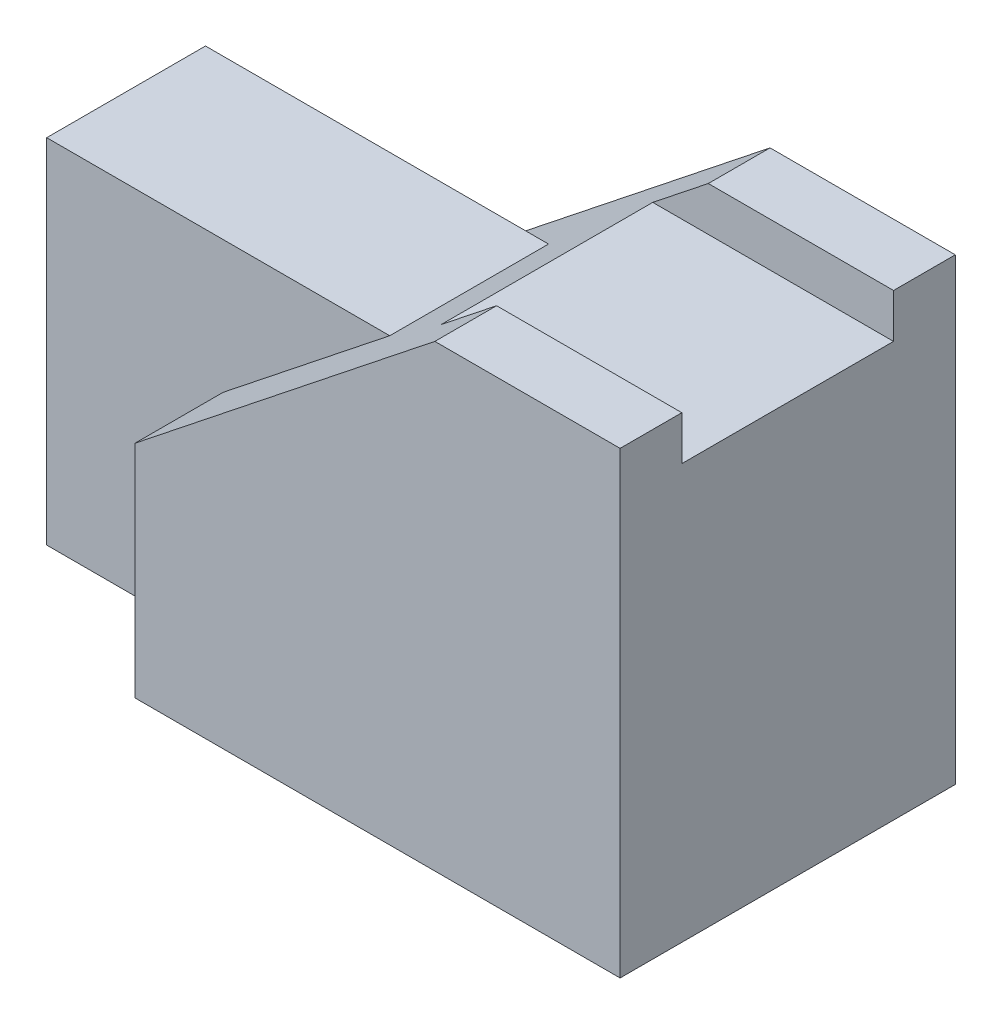
ISO-10303-21;
HEADER;
FILE_DESCRIPTION(('STEP AP214'),'2;1');
FILE_NAME('part.step','',(''),(''),'','','');
FILE_SCHEMA(('AUTOMOTIVE_DESIGN { 1 0 10303 214 1 1 1 1 }'));
ENDSEC;
DATA;
#1=APPLICATION_CONTEXT('core data for automotive mechanical design processes');
#2=APPLICATION_PROTOCOL_DEFINITION('international standard','automotive_design',2000,#1);
#3=PRODUCT_CONTEXT('',#1,'mechanical');
#4=PRODUCT('Part','Part','',(#3));
#5=PRODUCT_RELATED_PRODUCT_CATEGORY('part','',(#4));
#6=PRODUCT_DEFINITION_FORMATION('','',#4);
#7=PRODUCT_DEFINITION_CONTEXT('part definition',#1,'design');
#8=PRODUCT_DEFINITION('design','',#6,#7);
#9=PRODUCT_DEFINITION_SHAPE('','',#8);
#10=(LENGTH_UNIT() NAMED_UNIT(*) SI_UNIT(.MILLI.,.METRE.));
#11=(NAMED_UNIT(*) PLANE_ANGLE_UNIT() SI_UNIT($,.RADIAN.));
#12=(NAMED_UNIT(*) SI_UNIT($,.STERADIAN.) SOLID_ANGLE_UNIT());
#13=UNCERTAINTY_MEASURE_WITH_UNIT(LENGTH_MEASURE(1.E-05),#10,'distance_accuracy_value','');
#14=(GEOMETRIC_REPRESENTATION_CONTEXT(3) GLOBAL_UNCERTAINTY_ASSIGNED_CONTEXT((#13)) GLOBAL_UNIT_ASSIGNED_CONTEXT((#10,
#11,#12)) REPRESENTATION_CONTEXT('',''));
#15=CARTESIAN_POINT('',(0.,0.,0.));
#16=DIRECTION('',(0.,0.,1.));
#17=DIRECTION('',(1.,0.,0.));
#18=AXIS2_PLACEMENT_3D('',#15,#16,#17);
#19=CARTESIAN_POINT('',(0.,22.8737780043899,-19.));
#20=DIRECTION('',(0.,1.,0.));
#21=DIRECTION('',(0.,0.,1.));
#22=AXIS2_PLACEMENT_3D('',#19,#20,#21);
#23=PLANE('',#22);
#24=DIRECTION('',(1.,0.,0.));
#25=VECTOR('',#24,1.);
#26=CARTESIAN_POINT('',(-56.5700764194176,22.8737780043899,12.));
#27=LINE('',#26,#25);
#28=CARTESIAN_POINT('',(-1.57007641941765,22.8737780043899,12.));
#29=VERTEX_POINT('',#28);
#30=CARTESIAN_POINT('',(19.4299235805824,22.8737780043899,12.));
#31=VERTEX_POINT('',#30);
#32=EDGE_CURVE('E176',#29,#31,#27,.T.);
#33=ORIENTED_EDGE('',*,*,#32,.F.);
#34=DIRECTION('',(0.,0.,1.));
#35=VECTOR('',#34,1.);
#36=CARTESIAN_POINT('',(-1.57007641941765,22.8737780043899,-19.));
#37=LINE('',#36,#35);
#38=CARTESIAN_POINT('',(-1.57007641941765,22.8737780043899,19.));
#39=VERTEX_POINT('',#38);
#40=EDGE_CURVE('E51',#29,#39,#37,.T.);
#41=ORIENTED_EDGE('',*,*,#40,.T.);
#42=DIRECTION('',(-1.,0.,0.));
#43=VECTOR('',#42,1.);
#44=CARTESIAN_POINT('',(0.,22.8737780043899,19.));
#45=LINE('',#44,#43);
#46=CARTESIAN_POINT('',(19.4299235805824,22.8737780043899,19.));
#47=VERTEX_POINT('',#46);
#48=EDGE_CURVE('E249',#47,#39,#45,.T.);
#49=ORIENTED_EDGE('',*,*,#48,.F.);
#50=DIRECTION('',(0.,0.,1.));
#51=VECTOR('',#50,1.);
#52=CARTESIAN_POINT('',(19.4299235805824,22.8737780043899,-19.));
#53=LINE('',#52,#51);
#54=EDGE_CURVE('E273',#31,#47,#53,.T.);
#55=ORIENTED_EDGE('',*,*,#54,.F.);
#56=EDGE_LOOP('',(#33,#41,#49,#55));
#57=FACE_BOUND('',#56,.T.);
#58=ADVANCED_FACE('F41',(#57),#23,.T.);
#59=CARTESIAN_POINT('',(-11.7467978343689,14.7922639395757,-19.));
#60=DIRECTION('',(0.621882143601586,-0.783110847498294,0.));
#61=DIRECTION('',(0.783110847498294,0.621882143601586,0.));
#62=AXIS2_PLACEMENT_3D('',#59,#60,#61);
#63=PLANE('',#62);
#64=ORIENTED_EDGE('',*,*,#40,.F.);
#65=DIRECTION('',(-0.783110847498294,-0.621882143601586,0.));
#66=VECTOR('',#65,1.);
#67=CARTESIAN_POINT('',(-11.7467978343689,14.7922639395757,12.));
#68=LINE('',#67,#66);
#69=CARTESIAN_POINT('',(-7.86637271571394,17.8737780043899,12.));
#70=VERTEX_POINT('',#69);
#71=EDGE_CURVE('E186',#29,#70,#68,.T.);
#72=ORIENTED_EDGE('',*,*,#71,.T.);
#73=DIRECTION('',(0.,0.,-1.));
#74=VECTOR('',#73,1.);
#75=CARTESIAN_POINT('',(-7.86637271571394,17.8737780043899,-19.));
#76=LINE('',#75,#74);
#77=CARTESIAN_POINT('',(-7.86637271571394,17.8737780043899,-12.));
#78=VERTEX_POINT('',#77);
#79=EDGE_CURVE('E179',#70,#78,#76,.T.);
#80=ORIENTED_EDGE('',*,*,#79,.T.);
#81=DIRECTION('',(0.783110847498294,0.621882143601586,0.));
#82=VECTOR('',#81,1.);
#83=CARTESIAN_POINT('',(-11.7467978343689,14.7922639395757,-12.));
#84=LINE('',#83,#82);
#85=CARTESIAN_POINT('',(-1.57007641941765,22.8737780043899,-12.));
#86=VERTEX_POINT('',#85);
#87=EDGE_CURVE('E153',#78,#86,#84,.T.);
#88=ORIENTED_EDGE('',*,*,#87,.T.);
#89=CARTESIAN_POINT('',(-1.57007641941765,22.8737780043899,-19.));
#90=VERTEX_POINT('',#89);
#91=EDGE_CURVE('E11',#90,#86,#37,.T.);
#92=ORIENTED_EDGE('',*,*,#91,.F.);
#93=DIRECTION('',(0.783110847498294,0.621882143601586,0.));
#94=VECTOR('',#93,1.);
#95=CARTESIAN_POINT('',(-11.7467978343689,14.7922639395757,-19.));
#96=LINE('',#95,#94);
#97=CARTESIAN_POINT('',(-35.5700764194176,-4.12622199561007,-19.));
#98=VERTEX_POINT('',#97);
#99=EDGE_CURVE('E253',#98,#90,#96,.T.);
#100=ORIENTED_EDGE('',*,*,#99,.F.);
#101=DIRECTION('',(0.,0.,1.));
#102=VECTOR('',#101,1.);
#103=CARTESIAN_POINT('',(-35.5700764194176,-4.12622199561007,-19.));
#104=LINE('',#103,#102);
#105=CARTESIAN_POINT('',(-35.5700764194176,-4.12622199561007,-9.));
#106=VERTEX_POINT('',#105);
#107=EDGE_CURVE('E45',#98,#106,#104,.T.);
#108=ORIENTED_EDGE('',*,*,#107,.T.);
#109=DIRECTION('',(0.783110847498294,0.621882143601586,0.));
#110=VECTOR('',#109,1.);
#111=CARTESIAN_POINT('',(-11.7467978343689,14.7922639395757,-9.));
#112=LINE('',#111,#110);
#113=CARTESIAN_POINT('',(-16.6811875305287,10.8737780043899,-9.));
#114=VERTEX_POINT('',#113);
#115=EDGE_CURVE('E219',#106,#114,#112,.T.);
#116=ORIENTED_EDGE('',*,*,#115,.T.);
#117=DIRECTION('',(0.,0.,1.));
#118=VECTOR('',#117,1.);
#119=CARTESIAN_POINT('',(-16.6811875305287,10.8737780043899,-9.));
#120=LINE('',#119,#118);
#121=CARTESIAN_POINT('',(-16.6811875305287,10.8737780043899,9.));
#122=VERTEX_POINT('',#121);
#123=EDGE_CURVE('E224',#114,#122,#120,.T.);
#124=ORIENTED_EDGE('',*,*,#123,.T.);
#125=DIRECTION('',(0.783110847498294,0.621882143601586,0.));
#126=VECTOR('',#125,1.);
#127=CARTESIAN_POINT('',(-11.7467978343689,14.7922639395757,9.));
#128=LINE('',#127,#126);
#129=CARTESIAN_POINT('',(-35.5700764194176,-4.12622199561007,9.));
#130=VERTEX_POINT('',#129);
#131=EDGE_CURVE('E203',#130,#122,#128,.T.);
#132=ORIENTED_EDGE('',*,*,#131,.F.);
#133=CARTESIAN_POINT('',(-35.5700764194176,-4.12622199561007,19.));
#134=VERTEX_POINT('',#133);
#135=EDGE_CURVE('E269',#130,#134,#104,.T.);
#136=ORIENTED_EDGE('',*,*,#135,.T.);
#137=DIRECTION('',(0.783110847498294,0.621882143601586,0.));
#138=VECTOR('',#137,1.);
#139=CARTESIAN_POINT('',(-11.7467978343689,14.7922639395757,19.));
#140=LINE('',#139,#138);
#141=EDGE_CURVE('E228',#134,#39,#140,.T.);
#142=ORIENTED_EDGE('',*,*,#141,.T.);
#143=EDGE_LOOP('',(#64,#72,#80,#88,#92,#100,#108,#116,#124,#132,#136,#142));
#144=FACE_BOUND('',#143,.T.);
#145=ADVANCED_FACE('F43',(#144),#63,.F.);
#146=CARTESIAN_POINT('',(-35.5700764194176,0.,-19.));
#147=DIRECTION('',(1.,0.,0.));
#148=DIRECTION('',(0.,0.,-1.));
#149=AXIS2_PLACEMENT_3D('',#146,#147,#148);
#150=PLANE('',#149);
#151=DIRECTION('',(0.,1.,0.));
#152=VECTOR('',#151,1.);
#153=CARTESIAN_POINT('',(-35.5700764194176,0.,-9.));
#154=LINE('',#153,#152);
#155=CARTESIAN_POINT('',(-35.5700764194176,-29.1262219956101,-9.));
#156=VERTEX_POINT('',#155);
#157=EDGE_CURVE('E215',#156,#106,#154,.T.);
#158=ORIENTED_EDGE('',*,*,#157,.T.);
#159=ORIENTED_EDGE('',*,*,#107,.F.);
#160=DIRECTION('',(0.,1.,0.));
#161=VECTOR('',#160,1.);
#162=CARTESIAN_POINT('',(-35.5700764194176,0.,-19.));
#163=LINE('',#162,#161);
#164=CARTESIAN_POINT('',(-35.5700764194176,-29.1262219956101,-19.));
#165=VERTEX_POINT('',#164);
#166=EDGE_CURVE('E256',#165,#98,#163,.T.);
#167=ORIENTED_EDGE('',*,*,#166,.F.);
#168=DIRECTION('',(0.,0.,1.));
#169=VECTOR('',#168,1.);
#170=CARTESIAN_POINT('',(-35.5700764194176,-29.1262219956101,-19.));
#171=LINE('',#170,#169);
#172=EDGE_CURVE('E276',#165,#156,#171,.T.);
#173=ORIENTED_EDGE('',*,*,#172,.T.);
#174=EDGE_LOOP('',(#158,#159,#167,#173));
#175=FACE_BOUND('',#174,.T.);
#176=ADVANCED_FACE('F304',(#175),#150,.F.);
#177=DIRECTION('',(1.,0.,0.));
#178=VECTOR('',#177,1.);
#179=CARTESIAN_POINT('',(-56.5700764194176,22.8737780043899,-12.));
#180=LINE('',#179,#178);
#181=CARTESIAN_POINT('',(19.4299235805824,22.8737780043899,-12.));
#182=VERTEX_POINT('',#181);
#183=EDGE_CURVE('E157',#86,#182,#180,.T.);
#184=ORIENTED_EDGE('',*,*,#183,.T.);
#185=CARTESIAN_POINT('',(19.4299235805824,22.8737780043899,-19.));
#186=VERTEX_POINT('',#185);
#187=EDGE_CURVE('E169',#186,#182,#53,.T.);
#188=ORIENTED_EDGE('',*,*,#187,.F.);
#189=DIRECTION('',(-1.,0.,0.));
#190=VECTOR('',#189,1.);
#191=CARTESIAN_POINT('',(0.,22.8737780043899,-19.));
#192=LINE('',#191,#190);
#193=EDGE_CURVE('E266',#186,#90,#192,.T.);
#194=ORIENTED_EDGE('',*,*,#193,.T.);
#195=ORIENTED_EDGE('',*,*,#91,.T.);
#196=EDGE_LOOP('',(#184,#188,#194,#195));
#197=FACE_BOUND('',#196,.T.);
#198=ADVANCED_FACE('F314',(#197),#23,.T.);
#199=CARTESIAN_POINT('',(19.4299235805824,0.,-19.));
#200=DIRECTION('',(1.,0.,0.));
#201=DIRECTION('',(0.,0.,-1.));
#202=AXIS2_PLACEMENT_3D('',#199,#200,#201);
#203=PLANE('',#202);
#204=DIRECTION('',(0.,-1.,0.));
#205=VECTOR('',#204,1.);
#206=CARTESIAN_POINT('',(19.4299235805824,22.8737780043899,12.));
#207=LINE('',#206,#205);
#208=CARTESIAN_POINT('',(19.4299235805824,17.8737780043899,12.));
#209=VERTEX_POINT('',#208);
#210=EDGE_CURVE('E59',#31,#209,#207,.T.);
#211=ORIENTED_EDGE('',*,*,#210,.F.);
#212=ORIENTED_EDGE('',*,*,#54,.T.);
#213=DIRECTION('',(0.,1.,0.));
#214=VECTOR('',#213,1.);
#215=CARTESIAN_POINT('',(19.4299235805824,0.,19.));
#216=LINE('',#215,#214);
#217=CARTESIAN_POINT('',(19.4299235805824,-29.1262219956101,19.));
#218=VERTEX_POINT('',#217);
#219=EDGE_CURVE('E245',#218,#47,#216,.T.);
#220=ORIENTED_EDGE('',*,*,#219,.F.);
#221=DIRECTION('',(0.,0.,1.));
#222=VECTOR('',#221,1.);
#223=CARTESIAN_POINT('',(19.4299235805824,-29.1262219956101,-19.));
#224=LINE('',#223,#222);
#225=CARTESIAN_POINT('',(19.4299235805824,-29.1262219956101,-19.));
#226=VERTEX_POINT('',#225);
#227=EDGE_CURVE('E274',#226,#218,#224,.T.);
#228=ORIENTED_EDGE('',*,*,#227,.F.);
#229=DIRECTION('',(0.,1.,0.));
#230=VECTOR('',#229,1.);
#231=CARTESIAN_POINT('',(19.4299235805824,0.,-19.));
#232=LINE('',#231,#230);
#233=EDGE_CURVE('E263',#226,#186,#232,.T.);
#234=ORIENTED_EDGE('',*,*,#233,.T.);
#235=ORIENTED_EDGE('',*,*,#187,.T.);
#236=DIRECTION('',(0.,1.,0.));
#237=VECTOR('',#236,1.);
#238=CARTESIAN_POINT('',(19.4299235805824,17.8737780043899,-12.));
#239=LINE('',#238,#237);
#240=CARTESIAN_POINT('',(19.4299235805824,17.8737780043899,-12.));
#241=VERTEX_POINT('',#240);
#242=EDGE_CURVE('E150',#241,#182,#239,.T.);
#243=ORIENTED_EDGE('',*,*,#242,.F.);
#244=DIRECTION('',(0.,0.,-1.));
#245=VECTOR('',#244,1.);
#246=CARTESIAN_POINT('',(19.4299235805824,17.8737780043899,12.));
#247=LINE('',#246,#245);
#248=EDGE_CURVE('E161',#209,#241,#247,.T.);
#249=ORIENTED_EDGE('',*,*,#248,.F.);
#250=EDGE_LOOP('',(#211,#212,#220,#228,#234,#235,#243,#249));
#251=FACE_BOUND('',#250,.T.);
#252=ADVANCED_FACE('F167',(#251),#203,.T.);
#253=CARTESIAN_POINT('',(0.,-29.1262219956101,-19.));
#254=DIRECTION('',(0.,-1.,0.));
#255=DIRECTION('',(0.,0.,-1.));
#256=AXIS2_PLACEMENT_3D('',#253,#254,#255);
#257=PLANE('',#256);
#258=ORIENTED_EDGE('',*,*,#227,.T.);
#259=DIRECTION('',(1.,0.,0.));
#260=VECTOR('',#259,1.);
#261=CARTESIAN_POINT('',(0.,-29.1262219956101,19.));
#262=LINE('',#261,#260);
#263=CARTESIAN_POINT('',(-35.5700764194176,-29.1262219956101,19.));
#264=VERTEX_POINT('',#263);
#265=EDGE_CURVE('E241',#264,#218,#262,.T.);
#266=ORIENTED_EDGE('',*,*,#265,.F.);
#267=CARTESIAN_POINT('',(-35.5700764194176,-29.1262219956101,9.));
#268=VERTEX_POINT('',#267);
#269=EDGE_CURVE('E279',#268,#264,#171,.T.);
#270=ORIENTED_EDGE('',*,*,#269,.F.);
#271=DIRECTION('',(-1.,0.,0.));
#272=VECTOR('',#271,1.);
#273=CARTESIAN_POINT('',(0.,-29.1262219956101,9.));
#274=LINE('',#273,#272);
#275=CARTESIAN_POINT('',(-55.5700764194177,-29.1262219956101,9.));
#276=VERTEX_POINT('',#275);
#277=EDGE_CURVE('E67',#268,#276,#274,.T.);
#278=ORIENTED_EDGE('',*,*,#277,.T.);
#279=DIRECTION('',(0.,0.,1.));
#280=VECTOR('',#279,1.);
#281=CARTESIAN_POINT('',(-55.5700764194177,-29.1262219956101,-9.));
#282=LINE('',#281,#280);
#283=CARTESIAN_POINT('',(-55.5700764194177,-29.1262219956101,-9.));
#284=VERTEX_POINT('',#283);
#285=EDGE_CURVE('E229',#284,#276,#282,.T.);
#286=ORIENTED_EDGE('',*,*,#285,.F.);
#287=DIRECTION('',(-1.,0.,0.));
#288=VECTOR('',#287,1.);
#289=CARTESIAN_POINT('',(0.,-29.1262219956101,-9.));
#290=LINE('',#289,#288);
#291=EDGE_CURVE('E212',#156,#284,#290,.T.);
#292=ORIENTED_EDGE('',*,*,#291,.F.);
#293=ORIENTED_EDGE('',*,*,#172,.F.);
#294=DIRECTION('',(1.,0.,0.));
#295=VECTOR('',#294,1.);
#296=CARTESIAN_POINT('',(0.,-29.1262219956101,-19.));
#297=LINE('',#296,#295);
#298=EDGE_CURVE('E259',#165,#226,#297,.T.);
#299=ORIENTED_EDGE('',*,*,#298,.T.);
#300=EDGE_LOOP('',(#258,#266,#270,#278,#286,#292,#293,#299));
#301=FACE_BOUND('',#300,.T.);
#302=ADVANCED_FACE('F303',(#301),#257,.T.);
#303=ORIENTED_EDGE('',*,*,#135,.F.);
#304=DIRECTION('',(0.,1.,0.));
#305=VECTOR('',#304,1.);
#306=CARTESIAN_POINT('',(-35.5700764194176,0.,9.));
#307=LINE('',#306,#305);
#308=EDGE_CURVE('E200',#268,#130,#307,.T.);
#309=ORIENTED_EDGE('',*,*,#308,.F.);
#310=ORIENTED_EDGE('',*,*,#269,.T.);
#311=DIRECTION('',(0.,1.,0.));
#312=VECTOR('',#311,1.);
#313=CARTESIAN_POINT('',(-35.5700764194176,0.,19.));
#314=LINE('',#313,#312);
#315=EDGE_CURVE('E237',#264,#134,#314,.T.);
#316=ORIENTED_EDGE('',*,*,#315,.T.);
#317=EDGE_LOOP('',(#303,#309,#310,#316));
#318=FACE_BOUND('',#317,.T.);
#319=ADVANCED_FACE('F300',(#318),#150,.F.);
#320=CARTESIAN_POINT('',(0.,0.,-19.));
#321=DIRECTION('',(0.,0.,1.));
#322=DIRECTION('',(1.,0.,0.));
#323=AXIS2_PLACEMENT_3D('',#320,#321,#322);
#324=PLANE('',#323);
#325=ORIENTED_EDGE('',*,*,#99,.T.);
#326=ORIENTED_EDGE('',*,*,#193,.F.);
#327=ORIENTED_EDGE('',*,*,#233,.F.);
#328=ORIENTED_EDGE('',*,*,#298,.F.);
#329=ORIENTED_EDGE('',*,*,#166,.T.);
#330=EDGE_LOOP('',(#325,#326,#327,#328,#329));
#331=FACE_BOUND('',#330,.T.);
#332=ADVANCED_FACE('F302',(#331),#324,.F.);
#333=CARTESIAN_POINT('',(0.,0.,19.));
#334=DIRECTION('',(0.,0.,1.));
#335=DIRECTION('',(1.,0.,0.));
#336=AXIS2_PLACEMENT_3D('',#333,#334,#335);
#337=PLANE('',#336);
#338=ORIENTED_EDGE('',*,*,#141,.F.);
#339=ORIENTED_EDGE('',*,*,#315,.F.);
#340=ORIENTED_EDGE('',*,*,#265,.T.);
#341=ORIENTED_EDGE('',*,*,#219,.T.);
#342=ORIENTED_EDGE('',*,*,#48,.T.);
#343=EDGE_LOOP('',(#338,#339,#340,#341,#342));
#344=FACE_BOUND('',#343,.T.);
#345=ADVANCED_FACE('F298',(#344),#337,.T.);
#346=CARTESIAN_POINT('',(0.,10.8737780043899,-9.));
#347=DIRECTION('',(0.,-1.,0.));
#348=DIRECTION('',(0.,0.,-1.));
#349=AXIS2_PLACEMENT_3D('',#346,#347,#348);
#350=PLANE('',#349);
#351=DIRECTION('',(0.,0.,1.));
#352=VECTOR('',#351,1.);
#353=CARTESIAN_POINT('',(-55.5700764194177,10.8737780043899,-9.));
#354=LINE('',#353,#352);
#355=CARTESIAN_POINT('',(-55.5700764194177,10.8737780043899,-9.));
#356=VERTEX_POINT('',#355);
#357=CARTESIAN_POINT('',(-55.5700764194177,10.8737780043899,9.));
#358=VERTEX_POINT('',#357);
#359=EDGE_CURVE('E223',#356,#358,#354,.T.);
#360=ORIENTED_EDGE('',*,*,#359,.T.);
#361=DIRECTION('',(1.,0.,0.));
#362=VECTOR('',#361,1.);
#363=CARTESIAN_POINT('',(0.,10.8737780043899,9.));
#364=LINE('',#363,#362);
#365=EDGE_CURVE('E190',#358,#122,#364,.T.);
#366=ORIENTED_EDGE('',*,*,#365,.T.);
#367=ORIENTED_EDGE('',*,*,#123,.F.);
#368=DIRECTION('',(1.,0.,0.));
#369=VECTOR('',#368,1.);
#370=CARTESIAN_POINT('',(0.,10.8737780043899,-9.));
#371=LINE('',#370,#369);
#372=EDGE_CURVE('E206',#356,#114,#371,.T.);
#373=ORIENTED_EDGE('',*,*,#372,.F.);
#374=EDGE_LOOP('',(#360,#366,#367,#373));
#375=FACE_BOUND('',#374,.T.);
#376=ADVANCED_FACE('F344',(#375),#350,.F.);
#377=CARTESIAN_POINT('',(-55.5700764194177,0.,-9.));
#378=DIRECTION('',(1.,0.,0.));
#379=DIRECTION('',(0.,0.,-1.));
#380=AXIS2_PLACEMENT_3D('',#377,#378,#379);
#381=PLANE('',#380);
#382=ORIENTED_EDGE('',*,*,#285,.T.);
#383=DIRECTION('',(0.,1.,0.));
#384=VECTOR('',#383,1.);
#385=CARTESIAN_POINT('',(-55.5700764194177,0.,9.));
#386=LINE('',#385,#384);
#387=EDGE_CURVE('E194',#276,#358,#386,.T.);
#388=ORIENTED_EDGE('',*,*,#387,.T.);
#389=ORIENTED_EDGE('',*,*,#359,.F.);
#390=DIRECTION('',(0.,1.,0.));
#391=VECTOR('',#390,1.);
#392=CARTESIAN_POINT('',(-55.5700764194177,0.,-9.));
#393=LINE('',#392,#391);
#394=EDGE_CURVE('E209',#284,#356,#393,.T.);
#395=ORIENTED_EDGE('',*,*,#394,.F.);
#396=EDGE_LOOP('',(#382,#388,#389,#395));
#397=FACE_BOUND('',#396,.T.);
#398=ADVANCED_FACE('F349',(#397),#381,.F.);
#399=CARTESIAN_POINT('',(0.,0.,-9.));
#400=DIRECTION('',(0.,0.,1.));
#401=DIRECTION('',(1.,0.,0.));
#402=AXIS2_PLACEMENT_3D('',#399,#400,#401);
#403=PLANE('',#402);
#404=ORIENTED_EDGE('',*,*,#372,.T.);
#405=ORIENTED_EDGE('',*,*,#115,.F.);
#406=ORIENTED_EDGE('',*,*,#157,.F.);
#407=ORIENTED_EDGE('',*,*,#291,.T.);
#408=ORIENTED_EDGE('',*,*,#394,.T.);
#409=EDGE_LOOP('',(#404,#405,#406,#407,#408));
#410=FACE_BOUND('',#409,.T.);
#411=ADVANCED_FACE('F339',(#410),#403,.F.);
#412=CARTESIAN_POINT('',(0.,0.,9.));
#413=DIRECTION('',(0.,0.,1.));
#414=DIRECTION('',(1.,0.,0.));
#415=AXIS2_PLACEMENT_3D('',#412,#413,#414);
#416=PLANE('',#415);
#417=ORIENTED_EDGE('',*,*,#365,.F.);
#418=ORIENTED_EDGE('',*,*,#387,.F.);
#419=ORIENTED_EDGE('',*,*,#277,.F.);
#420=ORIENTED_EDGE('',*,*,#308,.T.);
#421=ORIENTED_EDGE('',*,*,#131,.T.);
#422=EDGE_LOOP('',(#417,#418,#419,#420,#421));
#423=FACE_BOUND('',#422,.T.);
#424=ADVANCED_FACE('F347',(#423),#416,.T.);
#425=CARTESIAN_POINT('',(-56.5700764194176,22.8737780043899,12.));
#426=DIRECTION('',(0.,0.,1.));
#427=DIRECTION('',(1.,0.,0.));
#428=AXIS2_PLACEMENT_3D('',#425,#426,#427);
#429=PLANE('',#428);
#430=ORIENTED_EDGE('',*,*,#32,.T.);
#431=ORIENTED_EDGE('',*,*,#210,.T.);
#432=DIRECTION('',(1.,0.,0.));
#433=VECTOR('',#432,1.);
#434=CARTESIAN_POINT('',(-56.5700764194176,17.8737780043899,12.));
#435=LINE('',#434,#433);
#436=EDGE_CURVE('E158',#70,#209,#435,.T.);
#437=ORIENTED_EDGE('',*,*,#436,.F.);
#438=ORIENTED_EDGE('',*,*,#71,.F.);
#439=EDGE_LOOP('',(#430,#431,#437,#438));
#440=FACE_BOUND('',#439,.T.);
#441=ADVANCED_FACE('F329',(#440),#429,.F.);
#442=CARTESIAN_POINT('',(-56.5700764194176,17.8737780043899,-12.));
#443=DIRECTION('',(0.,0.,-1.));
#444=DIRECTION('',(-1.,0.,0.));
#445=AXIS2_PLACEMENT_3D('',#442,#443,#444);
#446=PLANE('',#445);
#447=DIRECTION('',(1.,0.,0.));
#448=VECTOR('',#447,1.);
#449=CARTESIAN_POINT('',(-56.5700764194176,17.8737780043899,-12.));
#450=LINE('',#449,#448);
#451=EDGE_CURVE('E146',#78,#241,#450,.T.);
#452=ORIENTED_EDGE('',*,*,#451,.T.);
#453=ORIENTED_EDGE('',*,*,#242,.T.);
#454=ORIENTED_EDGE('',*,*,#183,.F.);
#455=ORIENTED_EDGE('',*,*,#87,.F.);
#456=EDGE_LOOP('',(#452,#453,#454,#455));
#457=FACE_BOUND('',#456,.T.);
#458=ADVANCED_FACE('F148',(#457),#446,.F.);
#459=CARTESIAN_POINT('',(-56.5700764194176,17.8737780043899,12.));
#460=DIRECTION('',(0.,-1.,0.));
#461=DIRECTION('',(0.,0.,-1.));
#462=AXIS2_PLACEMENT_3D('',#459,#460,#461);
#463=PLANE('',#462);
#464=ORIENTED_EDGE('',*,*,#436,.T.);
#465=ORIENTED_EDGE('',*,*,#248,.T.);
#466=ORIENTED_EDGE('',*,*,#451,.F.);
#467=ORIENTED_EDGE('',*,*,#79,.F.);
#468=EDGE_LOOP('',(#464,#465,#466,#467));
#469=FACE_BOUND('',#468,.T.);
#470=ADVANCED_FACE('F162',(#469),#463,.F.);
#471=CLOSED_SHELL('',(#58,#145,#176,#198,#252,#302,#319,#332,#345,#376,#398,#411,#424,#441,#458,#470));
#472=MANIFOLD_SOLID_BREP('B2',#471);
#473=ADVANCED_BREP_SHAPE_REPRESENTATION('',(#18,#472),#14);
#474=SHAPE_DEFINITION_REPRESENTATION(#9,#473);
ENDSEC;
END-ISO-10303-21;
